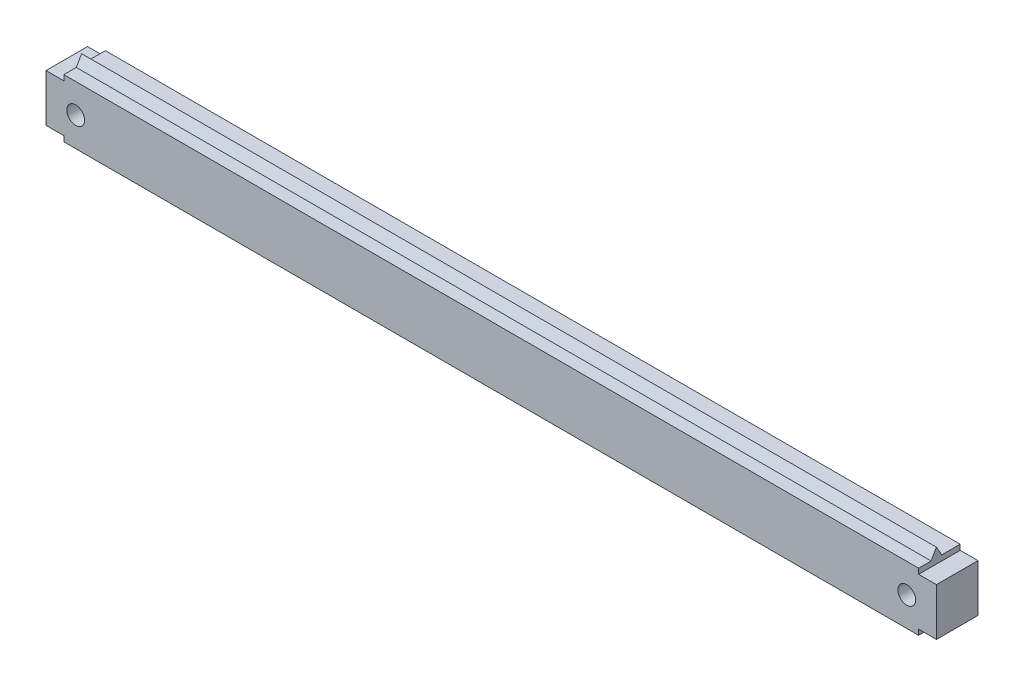
ISO-10303-21;
HEADER;
FILE_DESCRIPTION(('STEP AP214'),'2;1');
FILE_NAME('part.step','',(''),(''),'','','');
FILE_SCHEMA(('AUTOMOTIVE_DESIGN { 1 0 10303 214 1 1 1 1 }'));
ENDSEC;
DATA;
#1=APPLICATION_CONTEXT('core data for automotive mechanical design processes');
#2=APPLICATION_PROTOCOL_DEFINITION('international standard','automotive_design',2000,#1);
#3=PRODUCT_CONTEXT('',#1,'mechanical');
#4=PRODUCT('Part','Part','',(#3));
#5=PRODUCT_RELATED_PRODUCT_CATEGORY('part','',(#4));
#6=PRODUCT_DEFINITION_FORMATION('','',#4);
#7=PRODUCT_DEFINITION_CONTEXT('part definition',#1,'design');
#8=PRODUCT_DEFINITION('design','',#6,#7);
#9=PRODUCT_DEFINITION_SHAPE('','',#8);
#10=(LENGTH_UNIT() NAMED_UNIT(*) SI_UNIT(.MILLI.,.METRE.));
#11=(NAMED_UNIT(*) PLANE_ANGLE_UNIT() SI_UNIT($,.RADIAN.));
#12=(NAMED_UNIT(*) SI_UNIT($,.STERADIAN.) SOLID_ANGLE_UNIT());
#13=UNCERTAINTY_MEASURE_WITH_UNIT(LENGTH_MEASURE(1.E-05),#10,'distance_accuracy_value','');
#14=(GEOMETRIC_REPRESENTATION_CONTEXT(3) GLOBAL_UNCERTAINTY_ASSIGNED_CONTEXT((#13)) GLOBAL_UNIT_ASSIGNED_CONTEXT((#10,
#11,#12)) REPRESENTATION_CONTEXT('',''));
#15=CARTESIAN_POINT('',(0.,0.,0.));
#16=DIRECTION('',(0.,0.,1.));
#17=DIRECTION('',(1.,0.,0.));
#18=AXIS2_PLACEMENT_3D('',#15,#16,#17);
#19=CARTESIAN_POINT('',(0.,0.,7.));
#20=DIRECTION('',(1.,0.,0.));
#21=DIRECTION('',(0.,0.,-1.));
#22=AXIS2_PLACEMENT_3D('',#19,#20,#21);
#23=PLANE('',#22);
#24=DIRECTION('',(0.,-1.,0.));
#25=VECTOR('',#24,1.);
#26=CARTESIAN_POINT('',(0.,0.,7.));
#27=LINE('',#26,#25);
#28=CARTESIAN_POINT('',(0.,13.,7.));
#29=VERTEX_POINT('',#28);
#30=CARTESIAN_POINT('',(0.,5.,7.));
#31=VERTEX_POINT('',#30);
#32=EDGE_CURVE('E43',#29,#31,#27,.T.);
#33=ORIENTED_EDGE('',*,*,#32,.F.);
#34=DIRECTION('',(0.,0.,1.));
#35=VECTOR('',#34,1.);
#36=CARTESIAN_POINT('',(0.,13.,-0.00100000000000013));
#37=LINE('',#36,#35);
#38=CARTESIAN_POINT('',(0.,13.,0.));
#39=VERTEX_POINT('',#38);
#40=EDGE_CURVE('E277',#39,#29,#37,.T.);
#41=ORIENTED_EDGE('',*,*,#40,.F.);
#42=DIRECTION('',(0.,-1.,0.));
#43=VECTOR('',#42,1.);
#44=CARTESIAN_POINT('',(0.,0.,0.));
#45=LINE('',#44,#43);
#46=CARTESIAN_POINT('',(0.,5.,0.));
#47=VERTEX_POINT('',#46);
#48=EDGE_CURVE('E221',#39,#47,#45,.T.);
#49=ORIENTED_EDGE('',*,*,#48,.T.);
#50=DIRECTION('',(0.,0.,1.));
#51=VECTOR('',#50,1.);
#52=CARTESIAN_POINT('',(0.,5.,-0.00100000000000013));
#53=LINE('',#52,#51);
#54=EDGE_CURVE('E323',#47,#31,#53,.T.);
#55=ORIENTED_EDGE('',*,*,#54,.T.);
#56=EDGE_LOOP('',(#33,#41,#49,#55));
#57=FACE_BOUND('',#56,.T.);
#58=ADVANCED_FACE('F35',(#57),#23,.F.);
#59=CARTESIAN_POINT('',(150.,0.,7.));
#60=DIRECTION('',(-1.,0.,0.));
#61=DIRECTION('',(0.,0.,1.));
#62=AXIS2_PLACEMENT_3D('',#59,#60,#61);
#63=PLANE('',#62);
#64=DIRECTION('',(0.,1.,0.));
#65=VECTOR('',#64,1.);
#66=CARTESIAN_POINT('',(150.,0.,7.));
#67=LINE('',#66,#65);
#68=CARTESIAN_POINT('',(150.,5.,7.));
#69=VERTEX_POINT('',#68);
#70=CARTESIAN_POINT('',(150.,13.,7.));
#71=VERTEX_POINT('',#70);
#72=EDGE_CURVE('E11',#69,#71,#67,.T.);
#73=ORIENTED_EDGE('',*,*,#72,.F.);
#74=DIRECTION('',(0.,0.,1.));
#75=VECTOR('',#74,1.);
#76=CARTESIAN_POINT('',(150.,5.,-0.00100000000000013));
#77=LINE('',#76,#75);
#78=CARTESIAN_POINT('',(150.,5.,0.));
#79=VERTEX_POINT('',#78);
#80=EDGE_CURVE('E244',#79,#69,#77,.T.);
#81=ORIENTED_EDGE('',*,*,#80,.F.);
#82=DIRECTION('',(0.,1.,0.));
#83=VECTOR('',#82,1.);
#84=CARTESIAN_POINT('',(150.,0.,0.));
#85=LINE('',#84,#83);
#86=CARTESIAN_POINT('',(150.,13.,0.));
#87=VERTEX_POINT('',#86);
#88=EDGE_CURVE('E38',#79,#87,#85,.T.);
#89=ORIENTED_EDGE('',*,*,#88,.T.);
#90=DIRECTION('',(0.,0.,1.));
#91=VECTOR('',#90,1.);
#92=CARTESIAN_POINT('',(150.,13.,-0.00100000000000013));
#93=LINE('',#92,#91);
#94=EDGE_CURVE('E243',#87,#71,#93,.T.);
#95=ORIENTED_EDGE('',*,*,#94,.T.);
#96=EDGE_LOOP('',(#73,#81,#89,#95));
#97=FACE_BOUND('',#96,.T.);
#98=ADVANCED_FACE('F242',(#97),#63,.F.);
#99=CARTESIAN_POINT('',(0.,0.,7.));
#100=DIRECTION('',(0.,0.,-1.));
#101=DIRECTION('',(-1.,0.,0.));
#102=AXIS2_PLACEMENT_3D('',#99,#100,#101);
#103=PLANE('',#102);
#104=CARTESIAN_POINT('',(145.,9.00000000000002,7.));
#105=DIRECTION('',(0.,0.,1.));
#106=DIRECTION('',(-1.,0.,0.));
#107=AXIS2_PLACEMENT_3D('',#104,#105,#106);
#108=CIRCLE('',#107,1.5);
#109=CARTESIAN_POINT('',(143.5,9.00000000000002,7.));
#110=VERTEX_POINT('',#109);
#111=EDGE_CURVE('E225',#110,#110,#108,.T.);
#112=ORIENTED_EDGE('',*,*,#111,.F.);
#113=EDGE_LOOP('',(#112));
#114=FACE_BOUND('',#113,.T.);
#115=CARTESIAN_POINT('',(4.99999999999999,9.,7.));
#116=DIRECTION('',(0.,0.,1.));
#117=DIRECTION('',(1.,0.,0.));
#118=AXIS2_PLACEMENT_3D('',#115,#116,#117);
#119=CIRCLE('',#118,1.5);
#120=CARTESIAN_POINT('',(6.49999999999999,9.,7.));
#121=VERTEX_POINT('',#120);
#122=EDGE_CURVE('E218',#121,#121,#119,.T.);
#123=ORIENTED_EDGE('',*,*,#122,.F.);
#124=EDGE_LOOP('',(#123));
#125=FACE_BOUND('',#124,.T.);
#126=DIRECTION('',(1.,0.,0.));
#127=VECTOR('',#126,1.);
#128=CARTESIAN_POINT('',(-0.001000000000001,13.9,7.));
#129=LINE('',#128,#127);
#130=CARTESIAN_POINT('',(3.,13.9,7.));
#131=VERTEX_POINT('',#130);
#132=CARTESIAN_POINT('',(147.,13.9,7.));
#133=VERTEX_POINT('',#132);
#134=EDGE_CURVE('E182',#131,#133,#129,.T.);
#135=ORIENTED_EDGE('',*,*,#134,.F.);
#136=DIRECTION('',(0.,1.,0.));
#137=VECTOR('',#136,1.);
#138=CARTESIAN_POINT('',(3.,13.,7.));
#139=LINE('',#138,#137);
#140=CARTESIAN_POINT('',(3.,13.,7.));
#141=VERTEX_POINT('',#140);
#142=EDGE_CURVE('E274',#141,#131,#139,.T.);
#143=ORIENTED_EDGE('',*,*,#142,.F.);
#144=DIRECTION('',(1.,0.,0.));
#145=VECTOR('',#144,1.);
#146=CARTESIAN_POINT('',(0.,13.,7.));
#147=LINE('',#146,#145);
#148=EDGE_CURVE('E271',#29,#141,#147,.T.);
#149=ORIENTED_EDGE('',*,*,#148,.F.);
#150=ORIENTED_EDGE('',*,*,#32,.T.);
#151=DIRECTION('',(-1.,0.,0.));
#152=VECTOR('',#151,1.);
#153=CARTESIAN_POINT('',(3.,5.,7.));
#154=LINE('',#153,#152);
#155=CARTESIAN_POINT('',(3.,5.,7.));
#156=VERTEX_POINT('',#155);
#157=EDGE_CURVE('E318',#156,#31,#154,.T.);
#158=ORIENTED_EDGE('',*,*,#157,.F.);
#159=DIRECTION('',(0.,1.,0.));
#160=VECTOR('',#159,1.);
#161=CARTESIAN_POINT('',(3.,2.54115427318797,7.));
#162=LINE('',#161,#160);
#163=CARTESIAN_POINT('',(3.,4.1,7.));
#164=VERTEX_POINT('',#163);
#165=EDGE_CURVE('E320',#164,#156,#162,.T.);
#166=ORIENTED_EDGE('',*,*,#165,.F.);
#167=DIRECTION('',(1.,0.,0.));
#168=VECTOR('',#167,1.);
#169=CARTESIAN_POINT('',(-0.001000000000001,4.1,7.));
#170=LINE('',#169,#168);
#171=CARTESIAN_POINT('',(147.,4.1,7.));
#172=VERTEX_POINT('',#171);
#173=EDGE_CURVE('E214',#164,#172,#170,.T.);
#174=ORIENTED_EDGE('',*,*,#173,.T.);
#175=DIRECTION('',(0.,-1.,0.));
#176=VECTOR('',#175,1.);
#177=CARTESIAN_POINT('',(147.,2.54115427318797,7.));
#178=LINE('',#177,#176);
#179=CARTESIAN_POINT('',(147.,5.,7.));
#180=VERTEX_POINT('',#179);
#181=EDGE_CURVE('E297',#180,#172,#178,.T.);
#182=ORIENTED_EDGE('',*,*,#181,.F.);
#183=DIRECTION('',(-1.,0.,0.));
#184=VECTOR('',#183,1.);
#185=CARTESIAN_POINT('',(147.,5.,7.));
#186=LINE('',#185,#184);
#187=EDGE_CURVE('E299',#69,#180,#186,.T.);
#188=ORIENTED_EDGE('',*,*,#187,.F.);
#189=ORIENTED_EDGE('',*,*,#72,.T.);
#190=DIRECTION('',(1.,0.,0.));
#191=VECTOR('',#190,1.);
#192=CARTESIAN_POINT('',(150.,13.,7.));
#193=LINE('',#192,#191);
#194=CARTESIAN_POINT('',(147.,13.,7.));
#195=VERTEX_POINT('',#194);
#196=EDGE_CURVE('E357',#195,#71,#193,.T.);
#197=ORIENTED_EDGE('',*,*,#196,.F.);
#198=DIRECTION('',(0.,-1.,0.));
#199=VECTOR('',#198,1.);
#200=CARTESIAN_POINT('',(147.,13.,7.));
#201=LINE('',#200,#199);
#202=EDGE_CURVE('E358',#133,#195,#201,.T.);
#203=ORIENTED_EDGE('',*,*,#202,.F.);
#204=EDGE_LOOP('',(#135,#143,#149,#150,#158,#166,#174,#182,#188,#189,#197,#203));
#205=FACE_BOUND('',#204,.T.);
#206=ADVANCED_FACE('F329',(#114,#125,#205),#103,.F.);
#207=CARTESIAN_POINT('',(0.,0.,0.));
#208=DIRECTION('',(0.,0.,-1.));
#209=DIRECTION('',(-1.,0.,0.));
#210=AXIS2_PLACEMENT_3D('',#207,#208,#209);
#211=PLANE('',#210);
#212=CARTESIAN_POINT('',(105.,9.,0.));
#213=DIRECTION('',(0.,0.,-1.));
#214=DIRECTION('',(-1.,0.,0.));
#215=AXIS2_PLACEMENT_3D('',#212,#213,#214);
#216=CIRCLE('',#215,3.00000000000001);
#217=CARTESIAN_POINT('',(102.,9.,0.));
#218=VERTEX_POINT('',#217);
#219=EDGE_CURVE('E371',#218,#218,#216,.T.);
#220=ORIENTED_EDGE('',*,*,#219,.F.);
#221=EDGE_LOOP('',(#220));
#222=FACE_BOUND('',#221,.T.);
#223=CARTESIAN_POINT('',(45.,9.00000000000001,0.));
#224=DIRECTION('',(0.,0.,-1.));
#225=DIRECTION('',(-1.,0.,0.));
#226=AXIS2_PLACEMENT_3D('',#223,#224,#225);
#227=CIRCLE('',#226,3.);
#228=CARTESIAN_POINT('',(42.,9.00000000000001,0.));
#229=VERTEX_POINT('',#228);
#230=EDGE_CURVE('E365',#229,#229,#227,.T.);
#231=ORIENTED_EDGE('',*,*,#230,.F.);
#232=EDGE_LOOP('',(#231));
#233=FACE_BOUND('',#232,.T.);
#234=DIRECTION('',(0.,1.,0.));
#235=VECTOR('',#234,1.);
#236=CARTESIAN_POINT('',(3.,13.,0.));
#237=LINE('',#236,#235);
#238=CARTESIAN_POINT('',(3.,13.,0.));
#239=VERTEX_POINT('',#238);
#240=CARTESIAN_POINT('',(3.,13.9,0.));
#241=VERTEX_POINT('',#240);
#242=EDGE_CURVE('E284',#239,#241,#237,.T.);
#243=ORIENTED_EDGE('',*,*,#242,.T.);
#244=DIRECTION('',(1.,0.,0.));
#245=VECTOR('',#244,1.);
#246=CARTESIAN_POINT('',(-0.001000000000001,13.9,0.));
#247=LINE('',#246,#245);
#248=CARTESIAN_POINT('',(147.,13.9,0.));
#249=VERTEX_POINT('',#248);
#250=EDGE_CURVE('E193',#241,#249,#247,.T.);
#251=ORIENTED_EDGE('',*,*,#250,.T.);
#252=DIRECTION('',(0.,-1.,0.));
#253=VECTOR('',#252,1.);
#254=CARTESIAN_POINT('',(147.,13.,0.));
#255=LINE('',#254,#253);
#256=CARTESIAN_POINT('',(147.,13.,0.));
#257=VERTEX_POINT('',#256);
#258=EDGE_CURVE('E183',#249,#257,#255,.T.);
#259=ORIENTED_EDGE('',*,*,#258,.T.);
#260=DIRECTION('',(1.,0.,0.));
#261=VECTOR('',#260,1.);
#262=CARTESIAN_POINT('',(150.,13.,0.));
#263=LINE('',#262,#261);
#264=EDGE_CURVE('E254',#257,#87,#263,.T.);
#265=ORIENTED_EDGE('',*,*,#264,.T.);
#266=ORIENTED_EDGE('',*,*,#88,.F.);
#267=DIRECTION('',(-1.,0.,0.));
#268=VECTOR('',#267,1.);
#269=CARTESIAN_POINT('',(147.,5.,0.));
#270=LINE('',#269,#268);
#271=CARTESIAN_POINT('',(147.,5.,0.));
#272=VERTEX_POINT('',#271);
#273=EDGE_CURVE('E252',#79,#272,#270,.T.);
#274=ORIENTED_EDGE('',*,*,#273,.T.);
#275=DIRECTION('',(0.,-1.,0.));
#276=VECTOR('',#275,1.);
#277=CARTESIAN_POINT('',(147.,2.54115427318797,0.));
#278=LINE('',#277,#276);
#279=CARTESIAN_POINT('',(147.,4.1,0.));
#280=VERTEX_POINT('',#279);
#281=EDGE_CURVE('E295',#272,#280,#278,.T.);
#282=ORIENTED_EDGE('',*,*,#281,.T.);
#283=DIRECTION('',(1.,0.,0.));
#284=VECTOR('',#283,1.);
#285=CARTESIAN_POINT('',(-0.001000000000001,4.09999999999998,0.));
#286=LINE('',#285,#284);
#287=CARTESIAN_POINT('',(3.,4.09999999999998,0.));
#288=VERTEX_POINT('',#287);
#289=EDGE_CURVE('E211',#288,#280,#286,.T.);
#290=ORIENTED_EDGE('',*,*,#289,.F.);
#291=DIRECTION('',(0.,1.,0.));
#292=VECTOR('',#291,1.);
#293=CARTESIAN_POINT('',(3.,2.54115427318797,0.));
#294=LINE('',#293,#292);
#295=CARTESIAN_POINT('',(3.,5.,0.));
#296=VERTEX_POINT('',#295);
#297=EDGE_CURVE('E59',#288,#296,#294,.T.);
#298=ORIENTED_EDGE('',*,*,#297,.T.);
#299=DIRECTION('',(-1.,0.,0.));
#300=VECTOR('',#299,1.);
#301=CARTESIAN_POINT('',(3.,5.,0.));
#302=LINE('',#301,#300);
#303=EDGE_CURVE('E315',#296,#47,#302,.T.);
#304=ORIENTED_EDGE('',*,*,#303,.T.);
#305=ORIENTED_EDGE('',*,*,#48,.F.);
#306=DIRECTION('',(1.,0.,0.));
#307=VECTOR('',#306,1.);
#308=CARTESIAN_POINT('',(0.,13.,0.));
#309=LINE('',#308,#307);
#310=EDGE_CURVE('E267',#39,#239,#309,.T.);
#311=ORIENTED_EDGE('',*,*,#310,.T.);
#312=EDGE_LOOP('',(#243,#251,#259,#265,#266,#274,#282,#290,#298,#304,#305,#311));
#313=FACE_BOUND('',#312,.T.);
#314=CARTESIAN_POINT('',(4.99999999999999,9.,0.));
#315=DIRECTION('',(0.,0.,-1.));
#316=DIRECTION('',(-1.,0.,0.));
#317=AXIS2_PLACEMENT_3D('',#314,#315,#316);
#318=CIRCLE('',#317,1.5);
#319=CARTESIAN_POINT('',(3.49999999999999,9.,0.));
#320=VERTEX_POINT('',#319);
#321=EDGE_CURVE('E222',#320,#320,#318,.F.);
#322=ORIENTED_EDGE('',*,*,#321,.T.);
#323=EDGE_LOOP('',(#322));
#324=FACE_BOUND('',#323,.T.);
#325=CARTESIAN_POINT('',(145.,9.00000000000002,0.));
#326=DIRECTION('',(0.,0.,-1.));
#327=DIRECTION('',(-1.,0.,0.));
#328=AXIS2_PLACEMENT_3D('',#325,#326,#327);
#329=CIRCLE('',#328,1.5);
#330=CARTESIAN_POINT('',(143.5,9.00000000000002,0.));
#331=VERTEX_POINT('',#330);
#332=EDGE_CURVE('E191',#331,#331,#329,.F.);
#333=ORIENTED_EDGE('',*,*,#332,.T.);
#334=EDGE_LOOP('',(#333));
#335=FACE_BOUND('',#334,.T.);
#336=ADVANCED_FACE('F249',(#222,#233,#313,#324,#335),#211,.T.);
#337=CARTESIAN_POINT('',(145.,9.00000000000002,-0.00100000000000013));
#338=DIRECTION('',(0.,0.,1.));
#339=DIRECTION('',(1.,0.,0.));
#340=AXIS2_PLACEMENT_3D('',#337,#338,#339);
#341=CYLINDRICAL_SURFACE('',#340,1.5);
#342=ORIENTED_EDGE('',*,*,#332,.F.);
#343=EDGE_LOOP('',(#342));
#344=FACE_BOUND('',#343,.T.);
#345=ORIENTED_EDGE('',*,*,#111,.T.);
#346=EDGE_LOOP('',(#345));
#347=FACE_BOUND('',#346,.T.);
#348=ADVANCED_FACE('F388',(#344,#347),#341,.F.);
#349=CARTESIAN_POINT('',(4.99999999999999,9.,-0.00100000000000013));
#350=DIRECTION('',(0.,0.,1.));
#351=DIRECTION('',(1.,0.,0.));
#352=AXIS2_PLACEMENT_3D('',#349,#350,#351);
#353=CYLINDRICAL_SURFACE('',#352,1.5);
#354=ORIENTED_EDGE('',*,*,#321,.F.);
#355=EDGE_LOOP('',(#354));
#356=FACE_BOUND('',#355,.T.);
#357=ORIENTED_EDGE('',*,*,#122,.T.);
#358=EDGE_LOOP('',(#357));
#359=FACE_BOUND('',#358,.T.);
#360=ADVANCED_FACE('F418',(#356,#359),#353,.F.);
#361=CARTESIAN_POINT('',(-0.001000000000001,4.1,0.));
#362=DIRECTION('',(0.,-1.,0.));
#363=DIRECTION('',(0.,0.,-1.));
#364=AXIS2_PLACEMENT_3D('',#361,#362,#363);
#365=PLANE('',#364);
#366=DIRECTION('',(0.,0.,1.));
#367=VECTOR('',#366,1.);
#368=CARTESIAN_POINT('',(147.,4.1,-0.000999999999998845));
#369=LINE('',#368,#367);
#370=CARTESIAN_POINT('',(147.,4.1,4.9));
#371=VERTEX_POINT('',#370);
#372=EDGE_CURVE('E257',#371,#172,#369,.T.);
#373=ORIENTED_EDGE('',*,*,#372,.T.);
#374=ORIENTED_EDGE('',*,*,#173,.F.);
#375=DIRECTION('',(0.,0.,-1.));
#376=VECTOR('',#375,1.);
#377=CARTESIAN_POINT('',(3.,4.1,-0.000999999999998845));
#378=LINE('',#377,#376);
#379=CARTESIAN_POINT('',(3.,4.1,4.9));
#380=VERTEX_POINT('',#379);
#381=EDGE_CURVE('E286',#164,#380,#378,.T.);
#382=ORIENTED_EDGE('',*,*,#381,.T.);
#383=DIRECTION('',(1.,0.,0.));
#384=VECTOR('',#383,1.);
#385=CARTESIAN_POINT('',(-0.001000000000001,4.1,4.9));
#386=LINE('',#385,#384);
#387=EDGE_CURVE('E202',#380,#371,#386,.T.);
#388=ORIENTED_EDGE('',*,*,#387,.T.);
#389=EDGE_LOOP('',(#373,#374,#382,#388));
#390=FACE_BOUND('',#389,.T.);
#391=ADVANCED_FACE('F341',(#390),#365,.T.);
#392=CARTESIAN_POINT('',(-0.001000000000001,-1.09676223927188,1.89964792224191));
#393=DIRECTION('',(0.,-0.499999999999998,0.86602540378444));
#394=DIRECTION('',(0.,-0.86602540378444,-0.499999999999998));
#395=AXIS2_PLACEMENT_3D('',#392,#393,#394);
#396=PLANE('',#395);
#397=DIRECTION('',(0.,0.86602540378444,0.499999999999998));
#398=VECTOR('',#397,1.);
#399=CARTESIAN_POINT('',(147.,0.808670452917214,2.99974999999999));
#400=LINE('',#399,#398);
#401=CARTESIAN_POINT('',(147.,2.54115427318797,3.99999999999998));
#402=VERTEX_POINT('',#401);
#403=EDGE_CURVE('E289',#402,#371,#400,.T.);
#404=ORIENTED_EDGE('',*,*,#403,.T.);
#405=ORIENTED_EDGE('',*,*,#387,.F.);
#406=DIRECTION('',(0.,-0.86602540378444,-0.499999999999998));
#407=VECTOR('',#406,1.);
#408=CARTESIAN_POINT('',(3.,0.808670452917214,2.99974999999999));
#409=LINE('',#408,#407);
#410=CARTESIAN_POINT('',(3.,2.54115427318797,3.99999999999998));
#411=VERTEX_POINT('',#410);
#412=EDGE_CURVE('E311',#380,#411,#409,.T.);
#413=ORIENTED_EDGE('',*,*,#412,.T.);
#414=DIRECTION('',(1.,0.,0.));
#415=VECTOR('',#414,1.);
#416=CARTESIAN_POINT('',(-0.001000000000001,2.54115427318797,3.99999999999998));
#417=LINE('',#416,#415);
#418=EDGE_CURVE('E205',#411,#402,#417,.T.);
#419=ORIENTED_EDGE('',*,*,#418,.T.);
#420=EDGE_LOOP('',(#404,#405,#413,#419));
#421=FACE_BOUND('',#420,.T.);
#422=ADVANCED_FACE('F345',(#421),#396,.T.);
#423=CARTESIAN_POINT('',(-0.001000000000001,2.36733937586585,4.10035207775807));
#424=DIRECTION('',(0.,-0.499999999999997,-0.86602540378444));
#425=DIRECTION('',(0.,0.86602540378444,-0.499999999999997));
#426=AXIS2_PLACEMENT_3D('',#423,#424,#425);
#427=PLANE('',#426);
#428=DIRECTION('',(0.,-0.86602540378444,0.499999999999997));
#429=VECTOR('',#428,1.);
#430=CARTESIAN_POINT('',(147.,4.27363809345873,2.99975));
#431=LINE('',#430,#429);
#432=CARTESIAN_POINT('',(147.,4.09999999999997,3.09999999999998));
#433=VERTEX_POINT('',#432);
#434=EDGE_CURVE('E51',#433,#402,#431,.T.);
#435=ORIENTED_EDGE('',*,*,#434,.T.);
#436=ORIENTED_EDGE('',*,*,#418,.F.);
#437=DIRECTION('',(0.,0.86602540378444,-0.499999999999997));
#438=VECTOR('',#437,1.);
#439=CARTESIAN_POINT('',(3.,4.27363809345873,2.99975));
#440=LINE('',#439,#438);
#441=CARTESIAN_POINT('',(3.,4.09999999999997,3.09999999999998));
#442=VERTEX_POINT('',#441);
#443=EDGE_CURVE('E308',#411,#442,#440,.T.);
#444=ORIENTED_EDGE('',*,*,#443,.T.);
#445=DIRECTION('',(1.,0.,0.));
#446=VECTOR('',#445,1.);
#447=CARTESIAN_POINT('',(-0.001000000000001,4.09999999999997,3.09999999999998));
#448=LINE('',#447,#446);
#449=EDGE_CURVE('E208',#442,#433,#448,.T.);
#450=ORIENTED_EDGE('',*,*,#449,.T.);
#451=EDGE_LOOP('',(#435,#436,#444,#450));
#452=FACE_BOUND('',#451,.T.);
#453=ADVANCED_FACE('F348',(#452),#427,.T.);
#454=CARTESIAN_POINT('',(-0.001000000000001,4.1,0.));
#455=DIRECTION('',(0.,-1.,0.));
#456=DIRECTION('',(0.,0.,-1.));
#457=AXIS2_PLACEMENT_3D('',#454,#455,#456);
#458=PLANE('',#457);
#459=DIRECTION('',(0.,0.,1.));
#460=VECTOR('',#459,1.);
#461=CARTESIAN_POINT('',(147.,4.1,-0.000999999999982686));
#462=LINE('',#461,#460);
#463=EDGE_CURVE('E292',#280,#433,#462,.T.);
#464=ORIENTED_EDGE('',*,*,#463,.T.);
#465=ORIENTED_EDGE('',*,*,#449,.F.);
#466=DIRECTION('',(0.,0.,-1.));
#467=VECTOR('',#466,1.);
#468=CARTESIAN_POINT('',(3.,4.1,-0.000999999999982686));
#469=LINE('',#468,#467);
#470=EDGE_CURVE('E306',#442,#288,#469,.T.);
#471=ORIENTED_EDGE('',*,*,#470,.T.);
#472=ORIENTED_EDGE('',*,*,#289,.T.);
#473=EDGE_LOOP('',(#464,#465,#471,#472));
#474=FACE_BOUND('',#473,.T.);
#475=ADVANCED_FACE('F351',(#474),#458,.T.);
#476=CARTESIAN_POINT('',(-0.001000000000001,2.1326606241341,-3.69387655630184));
#477=DIRECTION('',(0.,-0.499999999999998,0.86602540378444));
#478=DIRECTION('',(0.,-0.86602540378444,-0.499999999999998));
#479=AXIS2_PLACEMENT_3D('',#476,#477,#478);
#480=PLANE('',#479);
#481=DIRECTION('',(1.,0.,0.));
#482=VECTOR('',#481,1.);
#483=CARTESIAN_POINT('',(-0.001000000000001,13.9,3.1));
#484=LINE('',#483,#482);
#485=CARTESIAN_POINT('',(3.,13.9,3.1));
#486=VERTEX_POINT('',#485);
#487=CARTESIAN_POINT('',(147.,13.9,3.1));
#488=VERTEX_POINT('',#487);
#489=EDGE_CURVE('E199',#486,#488,#484,.T.);
#490=ORIENTED_EDGE('',*,*,#489,.F.);
#491=DIRECTION('',(0.,-0.86602540378444,-0.499999999999998));
#492=VECTOR('',#491,1.);
#493=CARTESIAN_POINT('',(3.,11.8822276114322,1.93503856829699));
#494=LINE('',#493,#492);
#495=CARTESIAN_POINT('',(3.,15.458845726812,4.));
#496=VERTEX_POINT('',#495);
#497=EDGE_CURVE('E282',#496,#486,#494,.T.);
#498=ORIENTED_EDGE('',*,*,#497,.F.);
#499=DIRECTION('',(1.,0.,0.));
#500=VECTOR('',#499,1.);
#501=CARTESIAN_POINT('',(-0.001000000000001,15.458845726812,4.));
#502=LINE('',#501,#500);
#503=CARTESIAN_POINT('',(147.,15.458845726812,4.));
#504=VERTEX_POINT('',#503);
#505=EDGE_CURVE('E189',#496,#504,#502,.T.);
#506=ORIENTED_EDGE('',*,*,#505,.T.);
#507=DIRECTION('',(0.,0.86602540378444,0.499999999999998));
#508=VECTOR('',#507,1.);
#509=CARTESIAN_POINT('',(147.,11.8822276114322,1.93503856829699));
#510=LINE('',#509,#508);
#511=EDGE_CURVE('E168',#488,#504,#510,.T.);
#512=ORIENTED_EDGE('',*,*,#511,.F.);
#513=EDGE_LOOP('',(#490,#498,#506,#512));
#514=FACE_BOUND('',#513,.T.);
#515=ADVANCED_FACE('F427',(#514),#480,.F.);
#516=CARTESIAN_POINT('',(-0.001000000000001,5.59676223927169,9.69387655630181));
#517=DIRECTION('',(0.,-0.499999999999989,-0.866025403784445));
#518=DIRECTION('',(0.,0.866025403784445,-0.499999999999989));
#519=AXIS2_PLACEMENT_3D('',#516,#517,#518);
#520=PLANE('',#519);
#521=ORIENTED_EDGE('',*,*,#505,.F.);
#522=DIRECTION('',(0.,0.866025403784445,-0.499999999999989));
#523=VECTOR('',#522,1.);
#524=CARTESIAN_POINT('',(3.,15.3471952519737,4.06446143170305));
#525=LINE('',#524,#523);
#526=CARTESIAN_POINT('',(3.,13.9,4.9));
#527=VERTEX_POINT('',#526);
#528=EDGE_CURVE('E188',#527,#496,#525,.T.);
#529=ORIENTED_EDGE('',*,*,#528,.F.);
#530=DIRECTION('',(1.,0.,0.));
#531=VECTOR('',#530,1.);
#532=CARTESIAN_POINT('',(-0.001000000000001,13.9,4.9));
#533=LINE('',#532,#531);
#534=CARTESIAN_POINT('',(147.,13.9,4.9));
#535=VERTEX_POINT('',#534);
#536=EDGE_CURVE('E180',#527,#535,#533,.T.);
#537=ORIENTED_EDGE('',*,*,#536,.T.);
#538=DIRECTION('',(0.,-0.866025403784445,0.499999999999989));
#539=VECTOR('',#538,1.);
#540=CARTESIAN_POINT('',(147.,15.3471952519737,4.06446143170305));
#541=LINE('',#540,#539);
#542=EDGE_CURVE('E161',#504,#535,#541,.T.);
#543=ORIENTED_EDGE('',*,*,#542,.F.);
#544=EDGE_LOOP('',(#521,#529,#537,#543));
#545=FACE_BOUND('',#544,.T.);
#546=ADVANCED_FACE('F187',(#545),#520,.F.);
#547=CARTESIAN_POINT('',(-0.001000000000001,13.9,0.));
#548=DIRECTION('',(0.,-1.,0.));
#549=DIRECTION('',(0.,0.,-1.));
#550=AXIS2_PLACEMENT_3D('',#547,#548,#549);
#551=PLANE('',#550);
#552=ORIENTED_EDGE('',*,*,#536,.F.);
#553=DIRECTION('',(0.,0.,-1.));
#554=VECTOR('',#553,1.);
#555=CARTESIAN_POINT('',(3.,13.9,-0.00100000000000088));
#556=LINE('',#555,#554);
#557=EDGE_CURVE('E265',#131,#527,#556,.T.);
#558=ORIENTED_EDGE('',*,*,#557,.F.);
#559=ORIENTED_EDGE('',*,*,#134,.T.);
#560=DIRECTION('',(0.,0.,1.));
#561=VECTOR('',#560,1.);
#562=CARTESIAN_POINT('',(147.,13.9,-0.00100000000000088));
#563=LINE('',#562,#561);
#564=EDGE_CURVE('E165',#535,#133,#563,.T.);
#565=ORIENTED_EDGE('',*,*,#564,.F.);
#566=EDGE_LOOP('',(#552,#558,#559,#565));
#567=FACE_BOUND('',#566,.T.);
#568=ADVANCED_FACE('F178',(#567),#551,.F.);
#569=CARTESIAN_POINT('',(-0.001000000000001,13.9,-2.02235182005812E-13));
#570=DIRECTION('',(0.,-1.,0.));
#571=DIRECTION('',(0.,0.,-1.));
#572=AXIS2_PLACEMENT_3D('',#569,#570,#571);
#573=PLANE('',#572);
#574=ORIENTED_EDGE('',*,*,#250,.F.);
#575=DIRECTION('',(0.,0.,-1.));
#576=VECTOR('',#575,1.);
#577=CARTESIAN_POINT('',(3.,13.9,-0.00100000000001323));
#578=LINE('',#577,#576);
#579=EDGE_CURVE('E279',#486,#241,#578,.T.);
#580=ORIENTED_EDGE('',*,*,#579,.F.);
#581=ORIENTED_EDGE('',*,*,#489,.T.);
#582=DIRECTION('',(0.,0.,1.));
#583=VECTOR('',#582,1.);
#584=CARTESIAN_POINT('',(147.,13.9,-0.00100000000001323));
#585=LINE('',#584,#583);
#586=EDGE_CURVE('E173',#249,#488,#585,.T.);
#587=ORIENTED_EDGE('',*,*,#586,.F.);
#588=EDGE_LOOP('',(#574,#580,#581,#587));
#589=FACE_BOUND('',#588,.T.);
#590=ADVANCED_FACE('F435',(#589),#573,.F.);
#591=CARTESIAN_POINT('',(147.,13.,-0.00100000000000013));
#592=DIRECTION('',(-1.,0.,0.));
#593=DIRECTION('',(0.,0.,1.));
#594=AXIS2_PLACEMENT_3D('',#591,#592,#593);
#595=PLANE('',#594);
#596=ORIENTED_EDGE('',*,*,#564,.T.);
#597=ORIENTED_EDGE('',*,*,#202,.T.);
#598=DIRECTION('',(0.,0.,1.));
#599=VECTOR('',#598,1.);
#600=CARTESIAN_POINT('',(147.,13.,-0.00100000000000013));
#601=LINE('',#600,#599);
#602=EDGE_CURVE('E261',#257,#195,#601,.T.);
#603=ORIENTED_EDGE('',*,*,#602,.F.);
#604=ORIENTED_EDGE('',*,*,#258,.F.);
#605=ORIENTED_EDGE('',*,*,#586,.T.);
#606=ORIENTED_EDGE('',*,*,#511,.T.);
#607=ORIENTED_EDGE('',*,*,#542,.T.);
#608=EDGE_LOOP('',(#596,#597,#603,#604,#605,#606,#607));
#609=FACE_BOUND('',#608,.T.);
#610=ADVANCED_FACE('F163',(#609),#595,.F.);
#611=CARTESIAN_POINT('',(150.,13.,-0.00100000000000013));
#612=DIRECTION('',(0.,-1.,0.));
#613=DIRECTION('',(0.,0.,-1.));
#614=AXIS2_PLACEMENT_3D('',#611,#612,#613);
#615=PLANE('',#614);
#616=ORIENTED_EDGE('',*,*,#602,.T.);
#617=ORIENTED_EDGE('',*,*,#196,.T.);
#618=ORIENTED_EDGE('',*,*,#94,.F.);
#619=ORIENTED_EDGE('',*,*,#264,.F.);
#620=EDGE_LOOP('',(#616,#617,#618,#619));
#621=FACE_BOUND('',#620,.T.);
#622=ADVANCED_FACE('F454',(#621),#615,.F.);
#623=CARTESIAN_POINT('',(3.,13.,-0.00100000000000013));
#624=DIRECTION('',(1.,0.,0.));
#625=DIRECTION('',(0.,0.,-1.));
#626=AXIS2_PLACEMENT_3D('',#623,#624,#625);
#627=PLANE('',#626);
#628=ORIENTED_EDGE('',*,*,#557,.T.);
#629=ORIENTED_EDGE('',*,*,#528,.T.);
#630=ORIENTED_EDGE('',*,*,#497,.T.);
#631=ORIENTED_EDGE('',*,*,#579,.T.);
#632=ORIENTED_EDGE('',*,*,#242,.F.);
#633=DIRECTION('',(0.,0.,1.));
#634=VECTOR('',#633,1.);
#635=CARTESIAN_POINT('',(3.,13.,-0.00100000000000013));
#636=LINE('',#635,#634);
#637=EDGE_CURVE('E276',#239,#141,#636,.T.);
#638=ORIENTED_EDGE('',*,*,#637,.T.);
#639=ORIENTED_EDGE('',*,*,#142,.T.);
#640=EDGE_LOOP('',(#628,#629,#630,#631,#632,#638,#639));
#641=FACE_BOUND('',#640,.T.);
#642=ADVANCED_FACE('F451',(#641),#627,.F.);
#643=CARTESIAN_POINT('',(0.,13.,-0.00100000000000013));
#644=DIRECTION('',(0.,-1.,0.));
#645=DIRECTION('',(0.,0.,-1.));
#646=AXIS2_PLACEMENT_3D('',#643,#644,#645);
#647=PLANE('',#646);
#648=ORIENTED_EDGE('',*,*,#40,.T.);
#649=ORIENTED_EDGE('',*,*,#148,.T.);
#650=ORIENTED_EDGE('',*,*,#637,.F.);
#651=ORIENTED_EDGE('',*,*,#310,.F.);
#652=EDGE_LOOP('',(#648,#649,#650,#651));
#653=FACE_BOUND('',#652,.T.);
#654=ADVANCED_FACE('F333',(#653),#647,.F.);
#655=CARTESIAN_POINT('',(3.,5.,-0.00100000000000013));
#656=DIRECTION('',(0.,1.,0.));
#657=DIRECTION('',(0.,0.,1.));
#658=AXIS2_PLACEMENT_3D('',#655,#656,#657);
#659=PLANE('',#658);
#660=DIRECTION('',(0.,0.,1.));
#661=VECTOR('',#660,1.);
#662=CARTESIAN_POINT('',(3.,5.,-0.00100000000000013));
#663=LINE('',#662,#661);
#664=EDGE_CURVE('E217',#296,#156,#663,.T.);
#665=ORIENTED_EDGE('',*,*,#664,.T.);
#666=ORIENTED_EDGE('',*,*,#157,.T.);
#667=ORIENTED_EDGE('',*,*,#54,.F.);
#668=ORIENTED_EDGE('',*,*,#303,.F.);
#669=EDGE_LOOP('',(#665,#666,#667,#668));
#670=FACE_BOUND('',#669,.T.);
#671=ADVANCED_FACE('F336',(#670),#659,.F.);
#672=CARTESIAN_POINT('',(3.,2.54115427318797,-0.00100000000000013));
#673=DIRECTION('',(1.,0.,0.));
#674=DIRECTION('',(0.,0.,-1.));
#675=AXIS2_PLACEMENT_3D('',#672,#673,#674);
#676=PLANE('',#675);
#677=ORIENTED_EDGE('',*,*,#470,.F.);
#678=ORIENTED_EDGE('',*,*,#443,.F.);
#679=ORIENTED_EDGE('',*,*,#412,.F.);
#680=ORIENTED_EDGE('',*,*,#381,.F.);
#681=ORIENTED_EDGE('',*,*,#165,.T.);
#682=ORIENTED_EDGE('',*,*,#664,.F.);
#683=ORIENTED_EDGE('',*,*,#297,.F.);
#684=EDGE_LOOP('',(#677,#678,#679,#680,#681,#682,#683));
#685=FACE_BOUND('',#684,.T.);
#686=ADVANCED_FACE('F337',(#685),#676,.F.);
#687=CARTESIAN_POINT('',(147.,2.54115427318797,-0.00100000000000013));
#688=DIRECTION('',(-1.,0.,0.));
#689=DIRECTION('',(0.,0.,1.));
#690=AXIS2_PLACEMENT_3D('',#687,#688,#689);
#691=PLANE('',#690);
#692=DIRECTION('',(0.,0.,1.));
#693=VECTOR('',#692,1.);
#694=CARTESIAN_POINT('',(147.,5.,-0.00100000000000013));
#695=LINE('',#694,#693);
#696=EDGE_CURVE('E268',#272,#180,#695,.T.);
#697=ORIENTED_EDGE('',*,*,#696,.T.);
#698=ORIENTED_EDGE('',*,*,#181,.T.);
#699=ORIENTED_EDGE('',*,*,#372,.F.);
#700=ORIENTED_EDGE('',*,*,#403,.F.);
#701=ORIENTED_EDGE('',*,*,#434,.F.);
#702=ORIENTED_EDGE('',*,*,#463,.F.);
#703=ORIENTED_EDGE('',*,*,#281,.F.);
#704=EDGE_LOOP('',(#697,#698,#699,#700,#701,#702,#703));
#705=FACE_BOUND('',#704,.T.);
#706=ADVANCED_FACE('F343',(#705),#691,.F.);
#707=CARTESIAN_POINT('',(147.,5.,-0.00100000000000013));
#708=DIRECTION('',(0.,1.,0.));
#709=DIRECTION('',(0.,0.,1.));
#710=AXIS2_PLACEMENT_3D('',#707,#708,#709);
#711=PLANE('',#710);
#712=ORIENTED_EDGE('',*,*,#80,.T.);
#713=ORIENTED_EDGE('',*,*,#187,.T.);
#714=ORIENTED_EDGE('',*,*,#696,.F.);
#715=ORIENTED_EDGE('',*,*,#273,.F.);
#716=EDGE_LOOP('',(#712,#713,#714,#715));
#717=FACE_BOUND('',#716,.T.);
#718=ADVANCED_FACE('F355',(#717),#711,.F.);
#719=CARTESIAN_POINT('',(45.,9.00000000000001,3.));
#720=DIRECTION('',(0.,0.,-1.));
#721=DIRECTION('',(-1.,0.,0.));
#722=AXIS2_PLACEMENT_3D('',#719,#720,#721);
#723=CYLINDRICAL_SURFACE('',#722,3.);
#724=CARTESIAN_POINT('',(45.,9.00000000000001,3.));
#725=DIRECTION('',(0.,0.,-1.));
#726=DIRECTION('',(-1.,0.,0.));
#727=AXIS2_PLACEMENT_3D('',#724,#725,#726);
#728=CIRCLE('',#727,3.);
#729=CARTESIAN_POINT('',(42.,9.00000000000001,3.));
#730=VERTEX_POINT('',#729);
#731=EDGE_CURVE('E368',#730,#730,#728,.T.);
#732=ORIENTED_EDGE('',*,*,#731,.F.);
#733=EDGE_LOOP('',(#732));
#734=FACE_BOUND('',#733,.T.);
#735=ORIENTED_EDGE('',*,*,#230,.T.);
#736=EDGE_LOOP('',(#735));
#737=FACE_BOUND('',#736,.T.);
#738=ADVANCED_FACE('F392',(#734,#737),#723,.F.);
#739=CARTESIAN_POINT('',(0.,0.,3.));
#740=DIRECTION('',(0.,0.,-1.));
#741=DIRECTION('',(-1.,0.,0.));
#742=AXIS2_PLACEMENT_3D('',#739,#740,#741);
#743=PLANE('',#742);
#744=ORIENTED_EDGE('',*,*,#731,.T.);
#745=EDGE_LOOP('',(#744));
#746=FACE_BOUND('',#745,.T.);
#747=ADVANCED_FACE('F382',(#746),#743,.T.);
#748=CARTESIAN_POINT('',(105.,9.,3.));
#749=DIRECTION('',(0.,0.,-1.));
#750=DIRECTION('',(-1.,0.,0.));
#751=AXIS2_PLACEMENT_3D('',#748,#749,#750);
#752=CYLINDRICAL_SURFACE('',#751,3.00000000000001);
#753=CARTESIAN_POINT('',(105.,9.,3.));
#754=DIRECTION('',(0.,0.,-1.));
#755=DIRECTION('',(-1.,0.,0.));
#756=AXIS2_PLACEMENT_3D('',#753,#754,#755);
#757=CIRCLE('',#756,3.00000000000001);
#758=CARTESIAN_POINT('',(102.,9.,3.));
#759=VERTEX_POINT('',#758);
#760=EDGE_CURVE('E184',#759,#759,#757,.T.);
#761=ORIENTED_EDGE('',*,*,#760,.F.);
#762=EDGE_LOOP('',(#761));
#763=FACE_BOUND('',#762,.T.);
#764=ORIENTED_EDGE('',*,*,#219,.T.);
#765=EDGE_LOOP('',(#764));
#766=FACE_BOUND('',#765,.T.);
#767=ADVANCED_FACE('F379',(#763,#766),#752,.F.);
#768=CARTESIAN_POINT('',(0.,0.,3.));
#769=DIRECTION('',(0.,0.,-1.));
#770=DIRECTION('',(-1.,0.,0.));
#771=AXIS2_PLACEMENT_3D('',#768,#769,#770);
#772=PLANE('',#771);
#773=ORIENTED_EDGE('',*,*,#760,.T.);
#774=EDGE_LOOP('',(#773));
#775=FACE_BOUND('',#774,.T.);
#776=ADVANCED_FACE('F377',(#775),#772,.T.);
#777=CLOSED_SHELL('',(#58,#98,#206,#336,#348,#360,#391,#422,#453,#475,#515,#546,#568,#590,#610,
#622,#642,#654,#671,#686,#706,#718,#738,#747,#767,#776));
#778=MANIFOLD_SOLID_BREP('B2',#777);
#779=ADVANCED_BREP_SHAPE_REPRESENTATION('',(#18,#778),#14);
#780=SHAPE_DEFINITION_REPRESENTATION(#9,#779);
ENDSEC;
END-ISO-10303-21;
